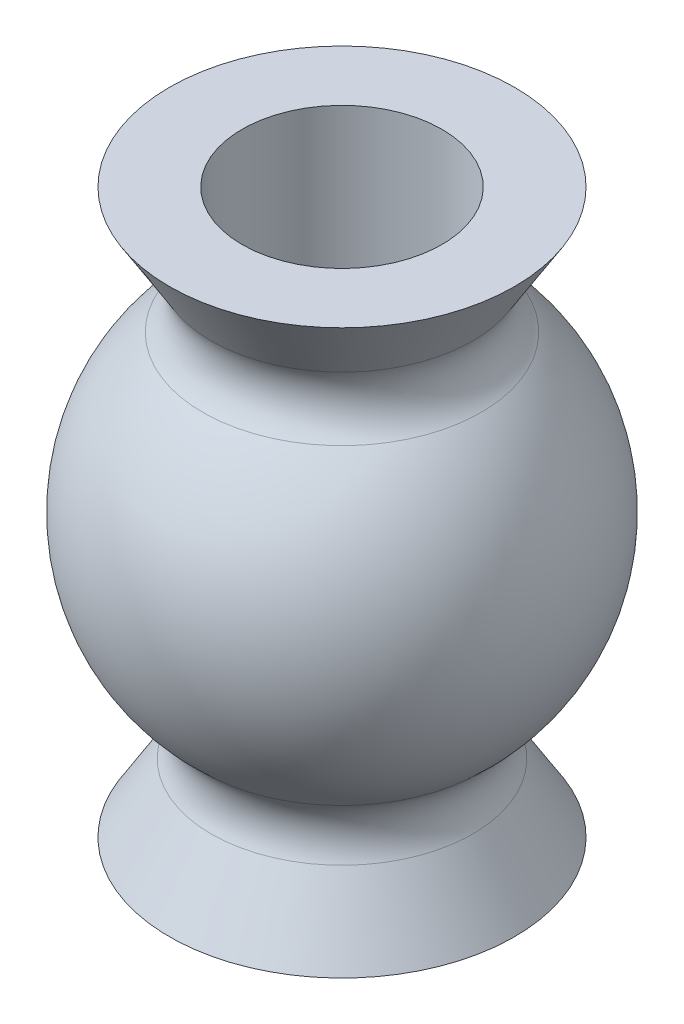
ISO-10303-21;
HEADER;
FILE_DESCRIPTION(('STEP AP214'),'2;1');
FILE_NAME('part.step','',(''),(''),'','','');
FILE_SCHEMA(('AUTOMOTIVE_DESIGN { 1 0 10303 214 1 1 1 1 }'));
ENDSEC;
DATA;
#1=APPLICATION_CONTEXT('core data for automotive mechanical design processes');
#2=APPLICATION_PROTOCOL_DEFINITION('international standard','automotive_design',2000,#1);
#3=PRODUCT_CONTEXT('',#1,'mechanical');
#4=PRODUCT('Part','Part','',(#3));
#5=PRODUCT_RELATED_PRODUCT_CATEGORY('part','',(#4));
#6=PRODUCT_DEFINITION_FORMATION('','',#4);
#7=PRODUCT_DEFINITION_CONTEXT('part definition',#1,'design');
#8=PRODUCT_DEFINITION('design','',#6,#7);
#9=PRODUCT_DEFINITION_SHAPE('','',#8);
#10=(LENGTH_UNIT() NAMED_UNIT(*) SI_UNIT(.MILLI.,.METRE.));
#11=(NAMED_UNIT(*) PLANE_ANGLE_UNIT() SI_UNIT($,.RADIAN.));
#12=(NAMED_UNIT(*) SI_UNIT($,.STERADIAN.) SOLID_ANGLE_UNIT());
#13=UNCERTAINTY_MEASURE_WITH_UNIT(LENGTH_MEASURE(1.E-05),#10,'distance_accuracy_value','');
#14=(GEOMETRIC_REPRESENTATION_CONTEXT(3) GLOBAL_UNCERTAINTY_ASSIGNED_CONTEXT((#13)) GLOBAL_UNIT_ASSIGNED_CONTEXT((#10,
#11,#12)) REPRESENTATION_CONTEXT('',''));
#15=CARTESIAN_POINT('',(0.,0.,0.));
#16=DIRECTION('',(0.,0.,1.));
#17=DIRECTION('',(1.,0.,0.));
#18=AXIS2_PLACEMENT_3D('',#15,#16,#17);
#19=CARTESIAN_POINT('',(0.,7.874,0.));
#20=DIRECTION('',(0.,1.,0.));
#21=DIRECTION('',(0.,0.,1.));
#22=AXIS2_PLACEMENT_3D('',#19,#20,#21);
#23=CONICAL_SURFACE('',#22,2.413,0.551514413605306);
#24=CARTESIAN_POINT('',(0.,6.92227531560709,0.));
#25=DIRECTION('',(0.,1.,0.));
#26=DIRECTION('',(0.,0.,1.));
#27=AXIS2_PLACEMENT_3D('',#24,#25,#26);
#28=CIRCLE('',#27,1.82750770145628);
#29=CARTESIAN_POINT('',(0.,6.92227531560709,1.82750770145628));
#30=VERTEX_POINT('',#29);
#31=EDGE_CURVE('E10',#30,#30,#28,.T.);
#32=ORIENTED_EDGE('',*,*,#31,.T.);
#33=EDGE_LOOP('',(#32));
#34=FACE_BOUND('',#33,.T.);
#35=CARTESIAN_POINT('',(0.,7.874,0.));
#36=DIRECTION('',(0.,-1.,0.));
#37=DIRECTION('',(0.,0.,-1.));
#38=AXIS2_PLACEMENT_3D('',#35,#36,#37);
#39=CIRCLE('',#38,2.413);
#40=CARTESIAN_POINT('',(0.,7.874,-2.413));
#41=VERTEX_POINT('',#40);
#42=EDGE_CURVE('E61',#41,#41,#39,.T.);
#43=ORIENTED_EDGE('',*,*,#42,.T.);
#44=EDGE_LOOP('',(#43));
#45=FACE_BOUND('',#44,.T.);
#46=ADVANCED_FACE('F32',(#34,#45),#23,.T.);
#47=CARTESIAN_POINT('',(0.,3.937,0.));
#48=DIRECTION('',(0.,-1.,0.));
#49=DIRECTION('',(-1.,0.,0.));
#50=AXIS2_PLACEMENT_3D('',#47,#48,#49);
#51=SPHERICAL_SURFACE('',#50,2.921);
#52=CARTESIAN_POINT('',(0.,1.75812007517683,0.));
#53=DIRECTION('',(0.,1.,0.));
#54=DIRECTION('',(0.,0.,1.));
#55=AXIS2_PLACEMENT_3D('',#52,#53,#54);
#56=CIRCLE('',#55,1.94543652510242);
#57=CARTESIAN_POINT('',(-1.94543652510242,1.75812007517683,0.));
#58=VERTEX_POINT('',#57);
#59=EDGE_CURVE('E39',#58,#58,#56,.T.);
#60=CARTESIAN_POINT('',(0.,6.11587992482317,0.));
#61=DIRECTION('',(0.,-1.,0.));
#62=DIRECTION('',(0.,0.,-1.));
#63=AXIS2_PLACEMENT_3D('',#60,#61,#62);
#64=CIRCLE('',#63,1.94543652510242);
#65=CARTESIAN_POINT('',(-1.94543652510242,6.11587992482317,0.));
#66=VERTEX_POINT('',#65);
#67=EDGE_CURVE('E43',#66,#66,#64,.T.);
#68=CARTESIAN_POINT('',(-1.94543652510242,1.75812007517683,0.));
#69=CARTESIAN_POINT('',(-1.98365590902679,1.79224287124738,0.));
#70=CARTESIAN_POINT('',(-2.02097563377797,1.82737309808154,0.));
#71=CARTESIAN_POINT('',(-2.09371659574887,1.89954698271369,0.));
#72=CARTESIAN_POINT('',(-2.12913783296858,1.93659064051169,0.));
#73=CARTESIAN_POINT('',(-2.19798265069141,2.01248995650815,0.));
#74=CARTESIAN_POINT('',(-2.23140623119454,2.0513456147066,0.));
#75=CARTESIAN_POINT('',(-2.29616350477706,2.13076106534034,0.));
#76=CARTESIAN_POINT('',(-2.32749719785647,2.17132085777562,0.));
#77=CARTESIAN_POINT('',(-2.3879878740916,2.25403237338375,0.));
#78=CARTESIAN_POINT('',(-2.41714485724733,2.29618409655659,0.));
#79=CARTESIAN_POINT('',(-2.47320141814736,2.38196276120843,0.));
#80=CARTESIAN_POINT('',(-2.50010099589166,2.42558970268742,0.));
#81=CARTESIAN_POINT('',(-2.55156827268673,2.51419803489858,0.));
#82=CARTESIAN_POINT('',(-2.5761359717375,2.55917942563075,0.));
#83=CARTESIAN_POINT('',(-2.62287148058869,2.65037213038376,0.));
#84=CARTESIAN_POINT('',(-2.64503929038911,2.6965834444046,0.));
#85=CARTESIAN_POINT('',(-2.68691365198092,2.79010806686763,0.));
#86=CARTESIAN_POINT('',(-2.70662020377231,2.83742137530982,0.));
#87=CARTESIAN_POINT('',(-2.74351749474236,2.93301900651217,0.));
#88=CARTESIAN_POINT('',(-2.76070823392102,2.98130332927233,0.));
#89=CARTESIAN_POINT('',(-2.79252630958246,3.07870932103647,0.));
#90=CARTESIAN_POINT('',(-2.80715364606523,3.12783099004046,0.));
#91=CARTESIAN_POINT('',(-2.83380442269556,3.22677568810949,0.));
#92=CARTESIAN_POINT('',(-2.84582786284313,3.27659871717454,0.));
#93=CARTESIAN_POINT('',(-2.86723756166085,3.37680820758001,0.));
#94=CARTESIAN_POINT('',(-2.87662382033101,3.42719466892043,0.));
#95=CARTESIAN_POINT('',(-2.89273317170663,3.52839153630821,0.));
#96=CARTESIAN_POINT('',(-2.89945626441209,3.57920194235556,0.));
#97=CARTESIAN_POINT('',(-2.91022067195676,3.6811060379604,0.));
#98=CARTESIAN_POINT('',(-2.91426198679597,3.73219972751788,0.));
#99=CARTESIAN_POINT('',(-2.91965165081759,3.83452894471691,0.));
#100=CARTESIAN_POINT('',(-2.921,3.88576447235845,0.));
#101=CARTESIAN_POINT('',(-2.921,3.98823552764154,0.));
#102=CARTESIAN_POINT('',(-2.91965165081759,4.03947105528309,0.));
#103=CARTESIAN_POINT('',(-2.91426198679597,4.14180027248212,0.));
#104=CARTESIAN_POINT('',(-2.91022067195676,4.1928939620396,0.));
#105=CARTESIAN_POINT('',(-2.89945626441209,4.29479805764444,0.));
#106=CARTESIAN_POINT('',(-2.89273317170663,4.34560846369179,0.));
#107=CARTESIAN_POINT('',(-2.87662382033101,4.44680533107957,0.));
#108=CARTESIAN_POINT('',(-2.86723756166085,4.49719179241999,0.));
#109=CARTESIAN_POINT('',(-2.84582786284313,4.59740128282546,0.));
#110=CARTESIAN_POINT('',(-2.83380442269556,4.64722431189051,0.));
#111=CARTESIAN_POINT('',(-2.80715364606523,4.74616900995954,0.));
#112=CARTESIAN_POINT('',(-2.79252630958246,4.79529067896353,0.));
#113=CARTESIAN_POINT('',(-2.76070823392102,4.89269667072767,0.));
#114=CARTESIAN_POINT('',(-2.74351749474236,4.94098099348783,0.));
#115=CARTESIAN_POINT('',(-2.70662020377231,5.03657862469018,0.));
#116=CARTESIAN_POINT('',(-2.68691365198092,5.08389193313237,0.));
#117=CARTESIAN_POINT('',(-2.64503929038911,5.1774165555954,0.));
#118=CARTESIAN_POINT('',(-2.62287148058869,5.22362786961624,0.));
#119=CARTESIAN_POINT('',(-2.5761359717375,5.31482057436925,0.));
#120=CARTESIAN_POINT('',(-2.55156827268673,5.35980196510142,0.));
#121=CARTESIAN_POINT('',(-2.50010099589166,5.44841029731258,0.));
#122=CARTESIAN_POINT('',(-2.47320141814736,5.49203723879157,0.));
#123=CARTESIAN_POINT('',(-2.41714485724733,5.57781590344341,0.));
#124=CARTESIAN_POINT('',(-2.3879878740916,5.61996762661625,0.));
#125=CARTESIAN_POINT('',(-2.32749719785647,5.70267914222438,0.));
#126=CARTESIAN_POINT('',(-2.29616350477706,5.74323893465966,0.));
#127=CARTESIAN_POINT('',(-2.23140623119454,5.8226543852934,0.));
#128=CARTESIAN_POINT('',(-2.19798265069141,5.86151004349185,0.));
#129=CARTESIAN_POINT('',(-2.12913783296858,5.93740935948831,0.));
#130=CARTESIAN_POINT('',(-2.09371659574887,5.97445301728631,0.));
#131=CARTESIAN_POINT('',(-2.02097563377797,6.04662690191846,0.));
#132=CARTESIAN_POINT('',(-1.98365590902679,6.08175712875262,0.));
#133=CARTESIAN_POINT('',(-1.94543652510242,6.11587992482317,0.));
#134=B_SPLINE_CURVE_WITH_KNOTS('',3,(#68,#69,#70,#71,#72,#73,#74,#75,#76,#77,#78,#79,#80,#81,
#82,#83,#84,#85,#86,#87,#88,#89,#90,#91,#92,#93,#94,#95,#96,#97,#98,#99,#100,#101,#102,#103,
#104,#105,#106,#107,#108,#109,#110,#111,#112,#113,#114,#115,#116,#117,#118,#119,#120,#121,#122,
#123,#124,#125,#126,#127,#128,#129,#130,#131,#132,#133),.UNSPECIFIED.,.F.,.F.,(4,2,2,2,2,2,2,2,
2,2,2,2,2,2,2,2,2,2,2,2,2,2,2,2,2,2,2,2,2,2,2,2,4),(0.,0.153688856234959,0.307377712469918,
0.461066568704877,0.614755424939837,0.768444281174796,0.922133137409755,1.07582199364471,
1.22951084987967,1.38319970611463,1.53688856234959,1.69057741858455,1.84426627481951,
1.99795513105447,2.15164398728943,2.30533284352439,2.45902169975935,2.61271055599431,
2.76639941222927,2.92008826846422,3.07377712469918,3.22746598093414,3.3811548371691,
3.53484369340406,3.68853254963902,3.84222140587398,3.99591026210894,4.1495991183439,
4.30328797457886,4.45697683081382,4.61066568704877,4.76435454328373,4.91804339951869),.UNSPECIFIED.);
#135=EDGE_CURVE('BSEAM85',#58,#66,#134,.T.);
#136=ORIENTED_EDGE('',*,*,#59,.T.);
#137=ORIENTED_EDGE('',*,*,#67,.T.);
#138=ORIENTED_EDGE('',*,*,#135,.T.);
#139=ORIENTED_EDGE('',*,*,#135,.F.);
#140=EDGE_LOOP('',(#136,#138,#137,#139));
#141=FACE_BOUND('',#140,.T.);
#142=ADVANCED_FACE('F85',(#141),#51,.T.);
#143=CARTESIAN_POINT('',(0.,0.,0.));
#144=DIRECTION('',(0.,-1.,0.));
#145=DIRECTION('',(0.,0.,-1.));
#146=AXIS2_PLACEMENT_3D('',#143,#144,#145);
#147=CONICAL_SURFACE('',#146,2.413,0.551514413605306);
#148=CARTESIAN_POINT('',(0.,0.951724684392913,0.));
#149=DIRECTION('',(0.,1.,0.));
#150=DIRECTION('',(0.,0.,1.));
#151=AXIS2_PLACEMENT_3D('',#148,#149,#150);
#152=CIRCLE('',#151,1.82750770145628);
#153=CARTESIAN_POINT('',(0.,0.951724684392913,1.82750770145628));
#154=VERTEX_POINT('',#153);
#155=EDGE_CURVE('E47',#154,#154,#152,.F.);
#156=ORIENTED_EDGE('',*,*,#155,.T.);
#157=EDGE_LOOP('',(#156));
#158=FACE_BOUND('',#157,.T.);
#159=CARTESIAN_POINT('',(0.,0.,0.));
#160=DIRECTION('',(0.,-1.,0.));
#161=DIRECTION('',(0.,0.,-1.));
#162=AXIS2_PLACEMENT_3D('',#159,#160,#161);
#163=CIRCLE('',#162,2.413);
#164=CARTESIAN_POINT('',(0.,0.,-2.413));
#165=VERTEX_POINT('',#164);
#166=EDGE_CURVE('E52',#165,#165,#163,.T.);
#167=ORIENTED_EDGE('',*,*,#166,.F.);
#168=EDGE_LOOP('',(#167));
#169=FACE_BOUND('',#168,.T.);
#170=ADVANCED_FACE('F81',(#158,#169),#147,.T.);
#171=CARTESIAN_POINT('',(0.,0.,0.));
#172=DIRECTION('',(0.,-1.,0.));
#173=DIRECTION('',(0.,0.,-1.));
#174=AXIS2_PLACEMENT_3D('',#171,#172,#173);
#175=PLANE('',#174);
#176=ORIENTED_EDGE('',*,*,#166,.T.);
#177=EDGE_LOOP('',(#176));
#178=FACE_BOUND('',#177,.T.);
#179=CARTESIAN_POINT('',(0.,0.,0.));
#180=DIRECTION('',(0.,-1.,0.));
#181=DIRECTION('',(0.,0.,-1.));
#182=AXIS2_PLACEMENT_3D('',#179,#180,#181);
#183=CIRCLE('',#182,1.397);
#184=CARTESIAN_POINT('',(0.,0.,-1.397));
#185=VERTEX_POINT('',#184);
#186=EDGE_CURVE('E55',#185,#185,#183,.T.);
#187=ORIENTED_EDGE('',*,*,#186,.F.);
#188=EDGE_LOOP('',(#187));
#189=FACE_BOUND('',#188,.T.);
#190=ADVANCED_FACE('F75',(#178,#189),#175,.T.);
#191=CARTESIAN_POINT('',(0.,0.,0.));
#192=DIRECTION('',(0.,-1.,0.));
#193=DIRECTION('',(0.,0.,-1.));
#194=AXIS2_PLACEMENT_3D('',#191,#192,#193);
#195=CYLINDRICAL_SURFACE('',#194,1.397);
#196=ORIENTED_EDGE('',*,*,#186,.T.);
#197=EDGE_LOOP('',(#196));
#198=FACE_BOUND('',#197,.T.);
#199=CARTESIAN_POINT('',(0.,7.874,0.));
#200=DIRECTION('',(0.,-1.,0.));
#201=DIRECTION('',(0.,0.,-1.));
#202=AXIS2_PLACEMENT_3D('',#199,#200,#201);
#203=CIRCLE('',#202,1.397);
#204=CARTESIAN_POINT('',(0.,7.874,-1.397));
#205=VERTEX_POINT('',#204);
#206=EDGE_CURVE('E58',#205,#205,#203,.T.);
#207=ORIENTED_EDGE('',*,*,#206,.F.);
#208=EDGE_LOOP('',(#207));
#209=FACE_BOUND('',#208,.T.);
#210=ADVANCED_FACE('F70',(#198,#209),#195,.F.);
#211=CARTESIAN_POINT('',(0.,7.874,0.));
#212=DIRECTION('',(0.,-1.,0.));
#213=DIRECTION('',(0.,0.,-1.));
#214=AXIS2_PLACEMENT_3D('',#211,#212,#213);
#215=PLANE('',#214);
#216=ORIENTED_EDGE('',*,*,#42,.F.);
#217=EDGE_LOOP('',(#216));
#218=FACE_BOUND('',#217,.T.);
#219=ORIENTED_EDGE('',*,*,#206,.T.);
#220=EDGE_LOOP('',(#219));
#221=FACE_BOUND('',#220,.T.);
#222=ADVANCED_FACE('F66',(#218,#221),#215,.F.);
#223=CARTESIAN_POINT('',(0.,1.28445052630223,0.));
#224=DIRECTION('',(0.,1.,0.));
#225=DIRECTION('',(0.,0.,1.));
#226=AXIS2_PLACEMENT_3D('',#223,#224,#225);
#227=TOROIDAL_SURFACE('',#226,2.36835750882034,0.635);
#228=ORIENTED_EDGE('',*,*,#59,.F.);
#229=EDGE_LOOP('',(#228));
#230=FACE_BOUND('',#229,.T.);
#231=ORIENTED_EDGE('',*,*,#155,.F.);
#232=EDGE_LOOP('',(#231));
#233=FACE_BOUND('',#232,.T.);
#234=ADVANCED_FACE('F69',(#230,#233),#227,.F.);
#235=CARTESIAN_POINT('',(0.,6.58954947369777,0.));
#236=DIRECTION('',(0.,-1.,0.));
#237=DIRECTION('',(0.,0.,-1.));
#238=AXIS2_PLACEMENT_3D('',#235,#236,#237);
#239=TOROIDAL_SURFACE('',#238,2.36835750882034,0.635);
#240=ORIENTED_EDGE('',*,*,#31,.F.);
#241=EDGE_LOOP('',(#240));
#242=FACE_BOUND('',#241,.T.);
#243=ORIENTED_EDGE('',*,*,#67,.F.);
#244=EDGE_LOOP('',(#243));
#245=FACE_BOUND('',#244,.T.);
#246=ADVANCED_FACE('F34',(#242,#245),#239,.F.);
#247=CLOSED_SHELL('',(#46,#142,#170,#190,#210,#222,#234,#246));
#248=MANIFOLD_SOLID_BREP('B2',#247);
#249=ADVANCED_BREP_SHAPE_REPRESENTATION('',(#18,#248),#14);
#250=SHAPE_DEFINITION_REPRESENTATION(#9,#249);
ENDSEC;
END-ISO-10303-21;
